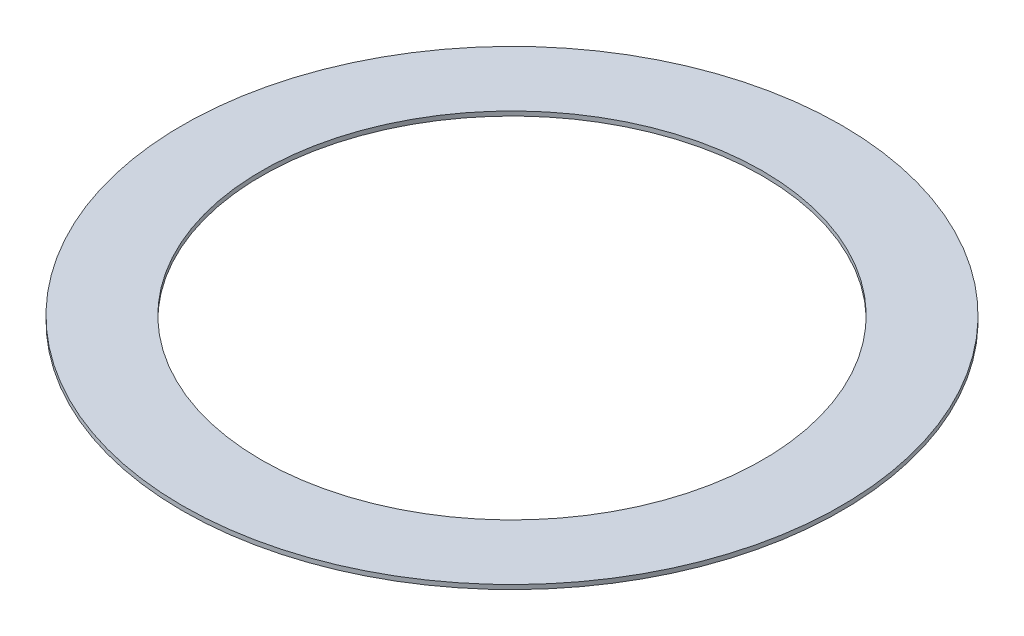
ISO-10303-21;
HEADER;
FILE_DESCRIPTION(('STEP AP214'),'2;1');
FILE_NAME('part.step','',(''),(''),'','','');
FILE_SCHEMA(('AUTOMOTIVE_DESIGN { 1 0 10303 214 1 1 1 1 }'));
ENDSEC;
DATA;
#1=APPLICATION_CONTEXT('core data for automotive mechanical design processes');
#2=APPLICATION_PROTOCOL_DEFINITION('international standard','automotive_design',2000,#1);
#3=PRODUCT_CONTEXT('',#1,'mechanical');
#4=PRODUCT('Part','Part','',(#3));
#5=PRODUCT_RELATED_PRODUCT_CATEGORY('part','',(#4));
#6=PRODUCT_DEFINITION_FORMATION('','',#4);
#7=PRODUCT_DEFINITION_CONTEXT('part definition',#1,'design');
#8=PRODUCT_DEFINITION('design','',#6,#7);
#9=PRODUCT_DEFINITION_SHAPE('','',#8);
#10=(LENGTH_UNIT() NAMED_UNIT(*) SI_UNIT(.MILLI.,.METRE.));
#11=(NAMED_UNIT(*) PLANE_ANGLE_UNIT() SI_UNIT($,.RADIAN.));
#12=(NAMED_UNIT(*) SI_UNIT($,.STERADIAN.) SOLID_ANGLE_UNIT());
#13=UNCERTAINTY_MEASURE_WITH_UNIT(LENGTH_MEASURE(1.E-05),#10,'distance_accuracy_value','');
#14=(GEOMETRIC_REPRESENTATION_CONTEXT(3) GLOBAL_UNCERTAINTY_ASSIGNED_CONTEXT((#13)) GLOBAL_UNIT_ASSIGNED_CONTEXT((#10,
#11,#12)) REPRESENTATION_CONTEXT('',''));
#15=CARTESIAN_POINT('',(0.,0.,0.));
#16=DIRECTION('',(0.,0.,1.));
#17=DIRECTION('',(1.,0.,0.));
#18=AXIS2_PLACEMENT_3D('',#15,#16,#17);
#19=CARTESIAN_POINT('',(0.,1.,0.));
#20=DIRECTION('',(0.,1.,0.));
#21=DIRECTION('',(0.,0.,1.));
#22=AXIS2_PLACEMENT_3D('',#19,#20,#21);
#23=PLANE('',#22);
#24=CARTESIAN_POINT('',(0.,1.,0.));
#25=DIRECTION('',(0.,1.,0.));
#26=DIRECTION('',(0.,0.,1.));
#27=AXIS2_PLACEMENT_3D('',#24,#25,#26);
#28=CIRCLE('',#27,75.);
#29=CARTESIAN_POINT('',(0.,1.,75.));
#30=VERTEX_POINT('',#29);
#31=EDGE_CURVE('E10',#30,#30,#28,.T.);
#32=ORIENTED_EDGE('',*,*,#31,.T.);
#33=EDGE_LOOP('',(#32));
#34=FACE_BOUND('',#33,.T.);
#35=CARTESIAN_POINT('',(0.,1.,0.));
#36=DIRECTION('',(0.,1.,0.));
#37=DIRECTION('',(0.,0.,1.));
#38=AXIS2_PLACEMENT_3D('',#35,#36,#37);
#39=CIRCLE('',#38,57.);
#40=CARTESIAN_POINT('',(0.,1.,57.));
#41=VERTEX_POINT('',#40);
#42=EDGE_CURVE('E42',#41,#41,#39,.T.);
#43=ORIENTED_EDGE('',*,*,#42,.F.);
#44=EDGE_LOOP('',(#43));
#45=FACE_BOUND('',#44,.T.);
#46=ADVANCED_FACE('F31',(#34,#45),#23,.T.);
#47=CARTESIAN_POINT('',(0.,0.,0.));
#48=DIRECTION('',(0.,1.,0.));
#49=DIRECTION('',(0.,0.,1.));
#50=AXIS2_PLACEMENT_3D('',#47,#48,#49);
#51=PLANE('',#50);
#52=CARTESIAN_POINT('',(0.,0.,0.));
#53=DIRECTION('',(0.,1.,0.));
#54=DIRECTION('',(0.,0.,1.));
#55=AXIS2_PLACEMENT_3D('',#52,#53,#54);
#56=CIRCLE('',#55,75.);
#57=CARTESIAN_POINT('',(0.,0.,75.));
#58=VERTEX_POINT('',#57);
#59=EDGE_CURVE('E35',#58,#58,#56,.T.);
#60=ORIENTED_EDGE('',*,*,#59,.F.);
#61=EDGE_LOOP('',(#60));
#62=FACE_BOUND('',#61,.T.);
#63=CARTESIAN_POINT('',(0.,0.,0.));
#64=DIRECTION('',(0.,1.,0.));
#65=DIRECTION('',(0.,0.,1.));
#66=AXIS2_PLACEMENT_3D('',#63,#64,#65);
#67=CIRCLE('',#66,57.);
#68=CARTESIAN_POINT('',(0.,0.,57.));
#69=VERTEX_POINT('',#68);
#70=EDGE_CURVE('E44',#69,#69,#67,.T.);
#71=ORIENTED_EDGE('',*,*,#70,.T.);
#72=EDGE_LOOP('',(#71));
#73=FACE_BOUND('',#72,.T.);
#74=ADVANCED_FACE('F54',(#62,#73),#51,.F.);
#75=CARTESIAN_POINT('',(0.,1.,0.));
#76=DIRECTION('',(0.,-1.,0.));
#77=DIRECTION('',(0.,0.,-1.));
#78=AXIS2_PLACEMENT_3D('',#75,#76,#77);
#79=CYLINDRICAL_SURFACE('',#78,75.);
#80=ORIENTED_EDGE('',*,*,#31,.F.);
#81=EDGE_LOOP('',(#80));
#82=FACE_BOUND('',#81,.T.);
#83=ORIENTED_EDGE('',*,*,#59,.T.);
#84=EDGE_LOOP('',(#83));
#85=FACE_BOUND('',#84,.T.);
#86=ADVANCED_FACE('F33',(#82,#85),#79,.T.);
#87=CARTESIAN_POINT('',(0.,1.,0.));
#88=DIRECTION('',(0.,-1.,0.));
#89=DIRECTION('',(0.,0.,-1.));
#90=AXIS2_PLACEMENT_3D('',#87,#88,#89);
#91=CYLINDRICAL_SURFACE('',#90,57.);
#92=ORIENTED_EDGE('',*,*,#42,.T.);
#93=EDGE_LOOP('',(#92));
#94=FACE_BOUND('',#93,.T.);
#95=ORIENTED_EDGE('',*,*,#70,.F.);
#96=EDGE_LOOP('',(#95));
#97=FACE_BOUND('',#96,.T.);
#98=ADVANCED_FACE('F50',(#94,#97),#91,.F.);
#99=CLOSED_SHELL('',(#46,#74,#86,#98));
#100=MANIFOLD_SOLID_BREP('B2',#99);
#101=ADVANCED_BREP_SHAPE_REPRESENTATION('',(#18,#100),#14);
#102=SHAPE_DEFINITION_REPRESENTATION(#9,#101);
ENDSEC;
END-ISO-10303-21;
